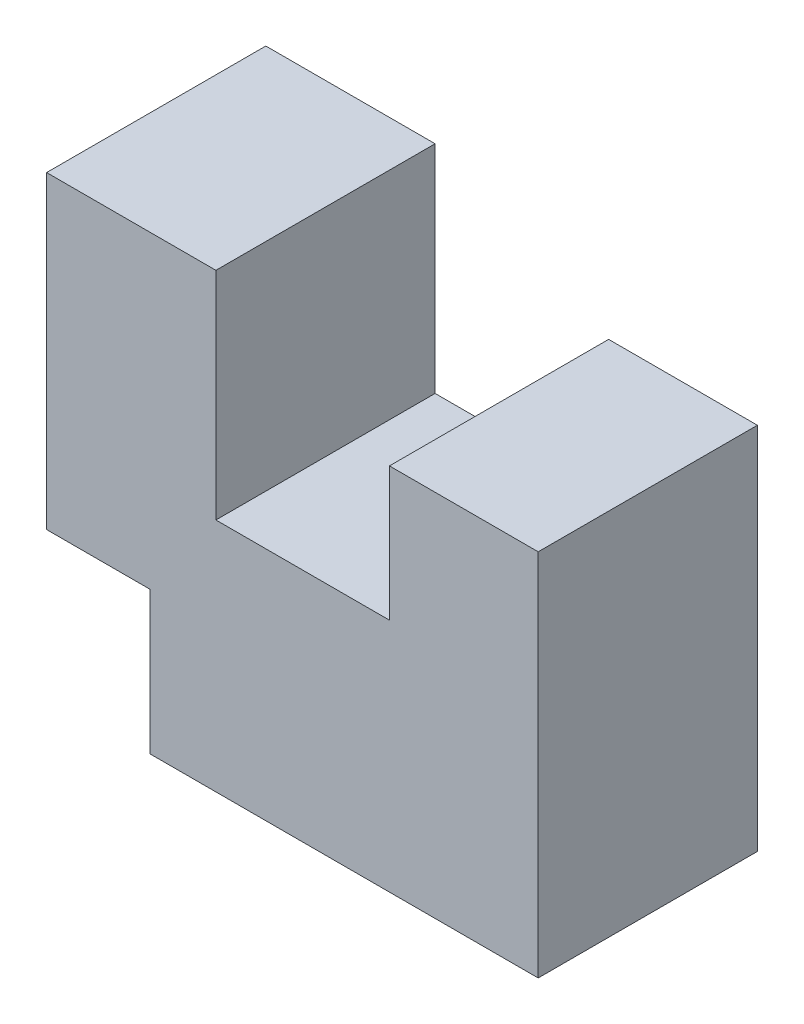
ISO-10303-21;
HEADER;
FILE_DESCRIPTION(('STEP AP214'),'2;1');
FILE_NAME('part.step','',(''),(''),'','','');
FILE_SCHEMA(('AUTOMOTIVE_DESIGN { 1 0 10303 214 1 1 1 1 }'));
ENDSEC;
DATA;
#1=APPLICATION_CONTEXT('core data for automotive mechanical design processes');
#2=APPLICATION_PROTOCOL_DEFINITION('international standard','automotive_design',2000,#1);
#3=PRODUCT_CONTEXT('',#1,'mechanical');
#4=PRODUCT('Part','Part','',(#3));
#5=PRODUCT_RELATED_PRODUCT_CATEGORY('part','',(#4));
#6=PRODUCT_DEFINITION_FORMATION('','',#4);
#7=PRODUCT_DEFINITION_CONTEXT('part definition',#1,'design');
#8=PRODUCT_DEFINITION('design','',#6,#7);
#9=PRODUCT_DEFINITION_SHAPE('','',#8);
#10=(LENGTH_UNIT() NAMED_UNIT(*) SI_UNIT(.MILLI.,.METRE.));
#11=(NAMED_UNIT(*) PLANE_ANGLE_UNIT() SI_UNIT($,.RADIAN.));
#12=(NAMED_UNIT(*) SI_UNIT($,.STERADIAN.) SOLID_ANGLE_UNIT());
#13=UNCERTAINTY_MEASURE_WITH_UNIT(LENGTH_MEASURE(1.E-05),#10,'distance_accuracy_value','');
#14=(GEOMETRIC_REPRESENTATION_CONTEXT(3) GLOBAL_UNCERTAINTY_ASSIGNED_CONTEXT((#13)) GLOBAL_UNIT_ASSIGNED_CONTEXT((#10,
#11,#12)) REPRESENTATION_CONTEXT('',''));
#15=CARTESIAN_POINT('',(0.,0.,0.));
#16=DIRECTION('',(0.,0.,1.));
#17=DIRECTION('',(1.,0.,0.));
#18=AXIS2_PLACEMENT_3D('',#15,#16,#17);
#19=CARTESIAN_POINT('',(18.8306553151543,0.,40.));
#20=DIRECTION('',(0.,1.,0.));
#21=DIRECTION('',(0.,0.,1.));
#22=AXIS2_PLACEMENT_3D('',#19,#20,#21);
#23=PLANE('',#22);
#24=DIRECTION('',(1.,0.,0.));
#25=VECTOR('',#24,1.);
#26=CARTESIAN_POINT('',(18.8306553151543,0.,0.));
#27=LINE('',#26,#25);
#28=CARTESIAN_POINT('',(0.,0.,0.));
#29=VERTEX_POINT('',#28);
#30=CARTESIAN_POINT('',(18.8306553151543,0.,0.));
#31=VERTEX_POINT('',#30);
#32=EDGE_CURVE('E141',#29,#31,#27,.T.);
#33=ORIENTED_EDGE('',*,*,#32,.T.);
#34=DIRECTION('',(0.,0.,-1.));
#35=VECTOR('',#34,1.);
#36=CARTESIAN_POINT('',(18.8306553151543,0.,40.));
#37=LINE('',#36,#35);
#38=CARTESIAN_POINT('',(18.8306553151543,0.,40.));
#39=VERTEX_POINT('',#38);
#40=EDGE_CURVE('E11',#39,#31,#37,.T.);
#41=ORIENTED_EDGE('',*,*,#40,.F.);
#42=DIRECTION('',(1.,0.,0.));
#43=VECTOR('',#42,1.);
#44=CARTESIAN_POINT('',(18.8306553151543,0.,40.));
#45=LINE('',#44,#43);
#46=CARTESIAN_POINT('',(0.,0.,40.));
#47=VERTEX_POINT('',#46);
#48=EDGE_CURVE('E159',#47,#39,#45,.T.);
#49=ORIENTED_EDGE('',*,*,#48,.F.);
#50=DIRECTION('',(0.,0.,-1.));
#51=VECTOR('',#50,1.);
#52=CARTESIAN_POINT('',(0.,0.,40.));
#53=LINE('',#52,#51);
#54=EDGE_CURVE('E137',#47,#29,#53,.T.);
#55=ORIENTED_EDGE('',*,*,#54,.T.);
#56=EDGE_LOOP('',(#33,#41,#49,#55));
#57=FACE_BOUND('',#56,.T.);
#58=ADVANCED_FACE('F33',(#57),#23,.F.);
#59=CARTESIAN_POINT('',(18.8306553151543,-26.0135622817229,40.));
#60=DIRECTION('',(1.,0.,0.));
#61=DIRECTION('',(0.,0.,-1.));
#62=AXIS2_PLACEMENT_3D('',#59,#60,#61);
#63=PLANE('',#62);
#64=DIRECTION('',(0.,-1.,0.));
#65=VECTOR('',#64,1.);
#66=CARTESIAN_POINT('',(18.8306553151543,-26.0135622817229,0.));
#67=LINE('',#66,#65);
#68=CARTESIAN_POINT('',(18.8306553151543,-26.0135622817229,0.));
#69=VERTEX_POINT('',#68);
#70=EDGE_CURVE('E144',#31,#69,#67,.T.);
#71=ORIENTED_EDGE('',*,*,#70,.T.);
#72=DIRECTION('',(0.,0.,-1.));
#73=VECTOR('',#72,1.);
#74=CARTESIAN_POINT('',(18.8306553151543,-26.0135622817229,40.));
#75=LINE('',#74,#73);
#76=CARTESIAN_POINT('',(18.8306553151543,-26.0135622817229,40.));
#77=VERTEX_POINT('',#76);
#78=EDGE_CURVE('E41',#77,#69,#75,.T.);
#79=ORIENTED_EDGE('',*,*,#78,.F.);
#80=DIRECTION('',(0.,-1.,0.));
#81=VECTOR('',#80,1.);
#82=CARTESIAN_POINT('',(18.8306553151543,-26.0135622817229,40.));
#83=LINE('',#82,#81);
#84=EDGE_CURVE('E98',#39,#77,#83,.T.);
#85=ORIENTED_EDGE('',*,*,#84,.F.);
#86=ORIENTED_EDGE('',*,*,#40,.T.);
#87=EDGE_LOOP('',(#71,#79,#85,#86));
#88=FACE_BOUND('',#87,.T.);
#89=ADVANCED_FACE('F208',(#88),#63,.F.);
#90=CARTESIAN_POINT('',(89.7081873291241,-26.0135622817229,40.));
#91=DIRECTION('',(0.,1.,0.));
#92=DIRECTION('',(0.,0.,1.));
#93=AXIS2_PLACEMENT_3D('',#90,#91,#92);
#94=PLANE('',#93);
#95=DIRECTION('',(1.,0.,0.));
#96=VECTOR('',#95,1.);
#97=CARTESIAN_POINT('',(89.7081873291241,-26.0135622817229,0.));
#98=LINE('',#97,#96);
#99=CARTESIAN_POINT('',(89.7081873291241,-26.0135622817229,0.));
#100=VERTEX_POINT('',#99);
#101=EDGE_CURVE('E146',#69,#100,#98,.T.);
#102=ORIENTED_EDGE('',*,*,#101,.T.);
#103=DIRECTION('',(0.,0.,-1.));
#104=VECTOR('',#103,1.);
#105=CARTESIAN_POINT('',(89.7081873291241,-26.0135622817229,40.));
#106=LINE('',#105,#104);
#107=CARTESIAN_POINT('',(89.7081873291241,-26.0135622817229,40.));
#108=VERTEX_POINT('',#107);
#109=EDGE_CURVE('E172',#108,#100,#106,.T.);
#110=ORIENTED_EDGE('',*,*,#109,.F.);
#111=DIRECTION('',(1.,0.,0.));
#112=VECTOR('',#111,1.);
#113=CARTESIAN_POINT('',(89.7081873291241,-26.0135622817229,40.));
#114=LINE('',#113,#112);
#115=EDGE_CURVE('E180',#77,#108,#114,.T.);
#116=ORIENTED_EDGE('',*,*,#115,.F.);
#117=ORIENTED_EDGE('',*,*,#78,.T.);
#118=EDGE_LOOP('',(#102,#110,#116,#117));
#119=FACE_BOUND('',#118,.T.);
#120=ADVANCED_FACE('F178',(#119),#94,.F.);
#121=CARTESIAN_POINT('',(89.7081873291241,41.345227008149,40.));
#122=DIRECTION('',(-1.,0.,0.));
#123=DIRECTION('',(0.,0.,1.));
#124=AXIS2_PLACEMENT_3D('',#121,#122,#123);
#125=PLANE('',#124);
#126=DIRECTION('',(0.,1.,0.));
#127=VECTOR('',#126,1.);
#128=CARTESIAN_POINT('',(89.7081873291241,41.345227008149,0.));
#129=LINE('',#128,#127);
#130=CARTESIAN_POINT('',(89.7081873291241,41.345227008149,0.));
#131=VERTEX_POINT('',#130);
#132=EDGE_CURVE('E148',#100,#131,#129,.T.);
#133=ORIENTED_EDGE('',*,*,#132,.T.);
#134=DIRECTION('',(0.,0.,-1.));
#135=VECTOR('',#134,1.);
#136=CARTESIAN_POINT('',(89.7081873291241,41.345227008149,40.));
#137=LINE('',#136,#135);
#138=CARTESIAN_POINT('',(89.7081873291241,41.345227008149,40.));
#139=VERTEX_POINT('',#138);
#140=EDGE_CURVE('E169',#139,#131,#137,.T.);
#141=ORIENTED_EDGE('',*,*,#140,.F.);
#142=DIRECTION('',(0.,1.,0.));
#143=VECTOR('',#142,1.);
#144=CARTESIAN_POINT('',(89.7081873291241,41.345227008149,40.));
#145=LINE('',#144,#143);
#146=EDGE_CURVE('E198',#108,#139,#145,.T.);
#147=ORIENTED_EDGE('',*,*,#146,.F.);
#148=ORIENTED_EDGE('',*,*,#109,.T.);
#149=EDGE_LOOP('',(#133,#141,#147,#148));
#150=FACE_BOUND('',#149,.T.);
#151=ADVANCED_FACE('F189',(#150),#125,.F.);
#152=CARTESIAN_POINT('',(62.5636006003696,41.345227008149,40.));
#153=DIRECTION('',(0.,-1.,0.));
#154=DIRECTION('',(0.,0.,-1.));
#155=AXIS2_PLACEMENT_3D('',#152,#153,#154);
#156=PLANE('',#155);
#157=DIRECTION('',(-1.,0.,0.));
#158=VECTOR('',#157,1.);
#159=CARTESIAN_POINT('',(62.5636006003696,41.345227008149,0.));
#160=LINE('',#159,#158);
#161=CARTESIAN_POINT('',(62.5636006003696,41.345227008149,0.));
#162=VERTEX_POINT('',#161);
#163=EDGE_CURVE('E150',#131,#162,#160,.T.);
#164=ORIENTED_EDGE('',*,*,#163,.T.);
#165=DIRECTION('',(0.,0.,-1.));
#166=VECTOR('',#165,1.);
#167=CARTESIAN_POINT('',(62.5636006003696,41.345227008149,40.));
#168=LINE('',#167,#166);
#169=CARTESIAN_POINT('',(62.5636006003696,41.345227008149,40.));
#170=VERTEX_POINT('',#169);
#171=EDGE_CURVE('E166',#170,#162,#168,.T.);
#172=ORIENTED_EDGE('',*,*,#171,.F.);
#173=DIRECTION('',(-1.,0.,0.));
#174=VECTOR('',#173,1.);
#175=CARTESIAN_POINT('',(62.5636006003696,41.345227008149,40.));
#176=LINE('',#175,#174);
#177=EDGE_CURVE('E195',#139,#170,#176,.T.);
#178=ORIENTED_EDGE('',*,*,#177,.F.);
#179=ORIENTED_EDGE('',*,*,#140,.T.);
#180=EDGE_LOOP('',(#164,#172,#178,#179));
#181=FACE_BOUND('',#180,.T.);
#182=ADVANCED_FACE('F193',(#181),#156,.F.);
#183=CARTESIAN_POINT('',(62.5636006003696,16.9653667054715,40.));
#184=DIRECTION('',(1.,0.,0.));
#185=DIRECTION('',(0.,0.,-1.));
#186=AXIS2_PLACEMENT_3D('',#183,#184,#185);
#187=PLANE('',#186);
#188=DIRECTION('',(0.,-1.,0.));
#189=VECTOR('',#188,1.);
#190=CARTESIAN_POINT('',(62.5636006003696,16.9653667054715,0.));
#191=LINE('',#190,#189);
#192=CARTESIAN_POINT('',(62.5636006003696,16.9653667054715,0.));
#193=VERTEX_POINT('',#192);
#194=EDGE_CURVE('E152',#162,#193,#191,.T.);
#195=ORIENTED_EDGE('',*,*,#194,.T.);
#196=DIRECTION('',(0.,0.,-1.));
#197=VECTOR('',#196,1.);
#198=CARTESIAN_POINT('',(62.5636006003696,16.9653667054715,40.));
#199=LINE('',#198,#197);
#200=CARTESIAN_POINT('',(62.5636006003696,16.9653667054715,40.));
#201=VERTEX_POINT('',#200);
#202=EDGE_CURVE('E163',#201,#193,#199,.T.);
#203=ORIENTED_EDGE('',*,*,#202,.F.);
#204=DIRECTION('',(0.,-1.,0.));
#205=VECTOR('',#204,1.);
#206=CARTESIAN_POINT('',(62.5636006003696,16.9653667054715,40.));
#207=LINE('',#206,#205);
#208=EDGE_CURVE('E197',#170,#201,#207,.T.);
#209=ORIENTED_EDGE('',*,*,#208,.F.);
#210=ORIENTED_EDGE('',*,*,#171,.T.);
#211=EDGE_LOOP('',(#195,#203,#209,#210));
#212=FACE_BOUND('',#211,.T.);
#213=ADVANCED_FACE('F220',(#212),#187,.F.);
#214=CARTESIAN_POINT('',(30.8949160834895,16.9653667054715,40.));
#215=DIRECTION('',(0.,-1.,0.));
#216=DIRECTION('',(0.,0.,-1.));
#217=AXIS2_PLACEMENT_3D('',#214,#215,#216);
#218=PLANE('',#217);
#219=DIRECTION('',(-1.,0.,0.));
#220=VECTOR('',#219,1.);
#221=CARTESIAN_POINT('',(30.8949160834895,16.9653667054715,0.));
#222=LINE('',#221,#220);
#223=CARTESIAN_POINT('',(30.8949160834895,16.9653667054715,0.));
#224=VERTEX_POINT('',#223);
#225=EDGE_CURVE('E154',#193,#224,#222,.T.);
#226=ORIENTED_EDGE('',*,*,#225,.T.);
#227=DIRECTION('',(0.,0.,-1.));
#228=VECTOR('',#227,1.);
#229=CARTESIAN_POINT('',(30.8949160834895,16.9653667054715,40.));
#230=LINE('',#229,#228);
#231=CARTESIAN_POINT('',(30.8949160834895,16.9653667054715,40.));
#232=VERTEX_POINT('',#231);
#233=EDGE_CURVE('E132',#232,#224,#230,.T.);
#234=ORIENTED_EDGE('',*,*,#233,.F.);
#235=DIRECTION('',(-1.,0.,0.));
#236=VECTOR('',#235,1.);
#237=CARTESIAN_POINT('',(30.8949160834895,16.9653667054715,40.));
#238=LINE('',#237,#236);
#239=EDGE_CURVE('E123',#201,#232,#238,.T.);
#240=ORIENTED_EDGE('',*,*,#239,.F.);
#241=ORIENTED_EDGE('',*,*,#202,.T.);
#242=EDGE_LOOP('',(#226,#234,#240,#241));
#243=FACE_BOUND('',#242,.T.);
#244=ADVANCED_FACE('F223',(#243),#218,.F.);
#245=CARTESIAN_POINT('',(30.8949160834895,56.4255529685681,40.));
#246=DIRECTION('',(-1.,0.,0.));
#247=DIRECTION('',(0.,0.,1.));
#248=AXIS2_PLACEMENT_3D('',#245,#246,#247);
#249=PLANE('',#248);
#250=DIRECTION('',(0.,1.,0.));
#251=VECTOR('',#250,1.);
#252=CARTESIAN_POINT('',(30.8949160834895,56.4255529685681,0.));
#253=LINE('',#252,#251);
#254=CARTESIAN_POINT('',(30.8949160834895,56.4255529685681,0.));
#255=VERTEX_POINT('',#254);
#256=EDGE_CURVE('E131',#224,#255,#253,.T.);
#257=ORIENTED_EDGE('',*,*,#256,.T.);
#258=DIRECTION('',(0.,0.,-1.));
#259=VECTOR('',#258,1.);
#260=CARTESIAN_POINT('',(30.8949160834895,56.4255529685681,40.));
#261=LINE('',#260,#259);
#262=CARTESIAN_POINT('',(30.8949160834895,56.4255529685681,40.));
#263=VERTEX_POINT('',#262);
#264=EDGE_CURVE('E128',#263,#255,#261,.T.);
#265=ORIENTED_EDGE('',*,*,#264,.F.);
#266=DIRECTION('',(0.,1.,0.));
#267=VECTOR('',#266,1.);
#268=CARTESIAN_POINT('',(30.8949160834895,56.4255529685681,40.));
#269=LINE('',#268,#267);
#270=EDGE_CURVE('E117',#232,#263,#269,.T.);
#271=ORIENTED_EDGE('',*,*,#270,.F.);
#272=ORIENTED_EDGE('',*,*,#233,.T.);
#273=EDGE_LOOP('',(#257,#265,#271,#272));
#274=FACE_BOUND('',#273,.T.);
#275=ADVANCED_FACE('F129',(#274),#249,.F.);
#276=CARTESIAN_POINT('',(0.,56.4255529685681,40.));
#277=DIRECTION('',(0.,-1.,0.));
#278=DIRECTION('',(0.,0.,-1.));
#279=AXIS2_PLACEMENT_3D('',#276,#277,#278);
#280=PLANE('',#279);
#281=DIRECTION('',(-1.,0.,0.));
#282=VECTOR('',#281,1.);
#283=CARTESIAN_POINT('',(0.,56.4255529685681,0.));
#284=LINE('',#283,#282);
#285=CARTESIAN_POINT('',(0.,56.4255529685681,0.));
#286=VERTEX_POINT('',#285);
#287=EDGE_CURVE('E84',#255,#286,#284,.T.);
#288=ORIENTED_EDGE('',*,*,#287,.T.);
#289=DIRECTION('',(0.,0.,-1.));
#290=VECTOR('',#289,1.);
#291=CARTESIAN_POINT('',(0.,56.4255529685681,40.));
#292=LINE('',#291,#290);
#293=CARTESIAN_POINT('',(0.,56.4255529685681,40.));
#294=VERTEX_POINT('',#293);
#295=EDGE_CURVE('E133',#294,#286,#292,.T.);
#296=ORIENTED_EDGE('',*,*,#295,.F.);
#297=DIRECTION('',(-1.,0.,0.));
#298=VECTOR('',#297,1.);
#299=CARTESIAN_POINT('',(0.,56.4255529685681,40.));
#300=LINE('',#299,#298);
#301=EDGE_CURVE('E121',#263,#294,#300,.T.);
#302=ORIENTED_EDGE('',*,*,#301,.F.);
#303=ORIENTED_EDGE('',*,*,#264,.T.);
#304=EDGE_LOOP('',(#288,#296,#302,#303));
#305=FACE_BOUND('',#304,.T.);
#306=ADVANCED_FACE('F135',(#305),#280,.F.);
#307=CARTESIAN_POINT('',(0.,0.,40.));
#308=DIRECTION('',(1.,0.,0.));
#309=DIRECTION('',(0.,0.,-1.));
#310=AXIS2_PLACEMENT_3D('',#307,#308,#309);
#311=PLANE('',#310);
#312=DIRECTION('',(0.,-1.,0.));
#313=VECTOR('',#312,1.);
#314=CARTESIAN_POINT('',(0.,0.,0.));
#315=LINE('',#314,#313);
#316=EDGE_CURVE('E90',#286,#29,#315,.T.);
#317=ORIENTED_EDGE('',*,*,#316,.T.);
#318=ORIENTED_EDGE('',*,*,#54,.F.);
#319=DIRECTION('',(0.,-1.,0.));
#320=VECTOR('',#319,1.);
#321=CARTESIAN_POINT('',(0.,0.,40.));
#322=LINE('',#321,#320);
#323=EDGE_CURVE('E49',#294,#47,#322,.T.);
#324=ORIENTED_EDGE('',*,*,#323,.F.);
#325=ORIENTED_EDGE('',*,*,#295,.T.);
#326=EDGE_LOOP('',(#317,#318,#324,#325));
#327=FACE_BOUND('',#326,.T.);
#328=ADVANCED_FACE('F232',(#327),#311,.F.);
#329=CARTESIAN_POINT('',(0.,0.,40.));
#330=DIRECTION('',(0.,0.,-1.));
#331=DIRECTION('',(-1.,0.,0.));
#332=AXIS2_PLACEMENT_3D('',#329,#330,#331);
#333=PLANE('',#332);
#334=ORIENTED_EDGE('',*,*,#48,.T.);
#335=ORIENTED_EDGE('',*,*,#84,.T.);
#336=ORIENTED_EDGE('',*,*,#115,.T.);
#337=ORIENTED_EDGE('',*,*,#146,.T.);
#338=ORIENTED_EDGE('',*,*,#177,.T.);
#339=ORIENTED_EDGE('',*,*,#208,.T.);
#340=ORIENTED_EDGE('',*,*,#239,.T.);
#341=ORIENTED_EDGE('',*,*,#270,.T.);
#342=ORIENTED_EDGE('',*,*,#301,.T.);
#343=ORIENTED_EDGE('',*,*,#323,.T.);
#344=EDGE_LOOP('',(#334,#335,#336,#337,#338,#339,#340,#341,#342,#343));
#345=FACE_BOUND('',#344,.T.);
#346=ADVANCED_FACE('F119',(#345),#333,.F.);
#347=CARTESIAN_POINT('',(0.,0.,0.));
#348=DIRECTION('',(0.,0.,-1.));
#349=DIRECTION('',(-1.,0.,0.));
#350=AXIS2_PLACEMENT_3D('',#347,#348,#349);
#351=PLANE('',#350);
#352=ORIENTED_EDGE('',*,*,#32,.F.);
#353=ORIENTED_EDGE('',*,*,#316,.F.);
#354=ORIENTED_EDGE('',*,*,#287,.F.);
#355=ORIENTED_EDGE('',*,*,#256,.F.);
#356=ORIENTED_EDGE('',*,*,#225,.F.);
#357=ORIENTED_EDGE('',*,*,#194,.F.);
#358=ORIENTED_EDGE('',*,*,#163,.F.);
#359=ORIENTED_EDGE('',*,*,#132,.F.);
#360=ORIENTED_EDGE('',*,*,#101,.F.);
#361=ORIENTED_EDGE('',*,*,#70,.F.);
#362=EDGE_LOOP('',(#352,#353,#354,#355,#356,#357,#358,#359,#360,#361));
#363=FACE_BOUND('',#362,.T.);
#364=ADVANCED_FACE('F184',(#363),#351,.T.);
#365=CLOSED_SHELL('',(#58,#89,#120,#151,#182,#213,#244,#275,#306,#328,#346,#364));
#366=MANIFOLD_SOLID_BREP('B2',#365);
#367=ADVANCED_BREP_SHAPE_REPRESENTATION('',(#18,#366),#14);
#368=SHAPE_DEFINITION_REPRESENTATION(#9,#367);
ENDSEC;
END-ISO-10303-21;
